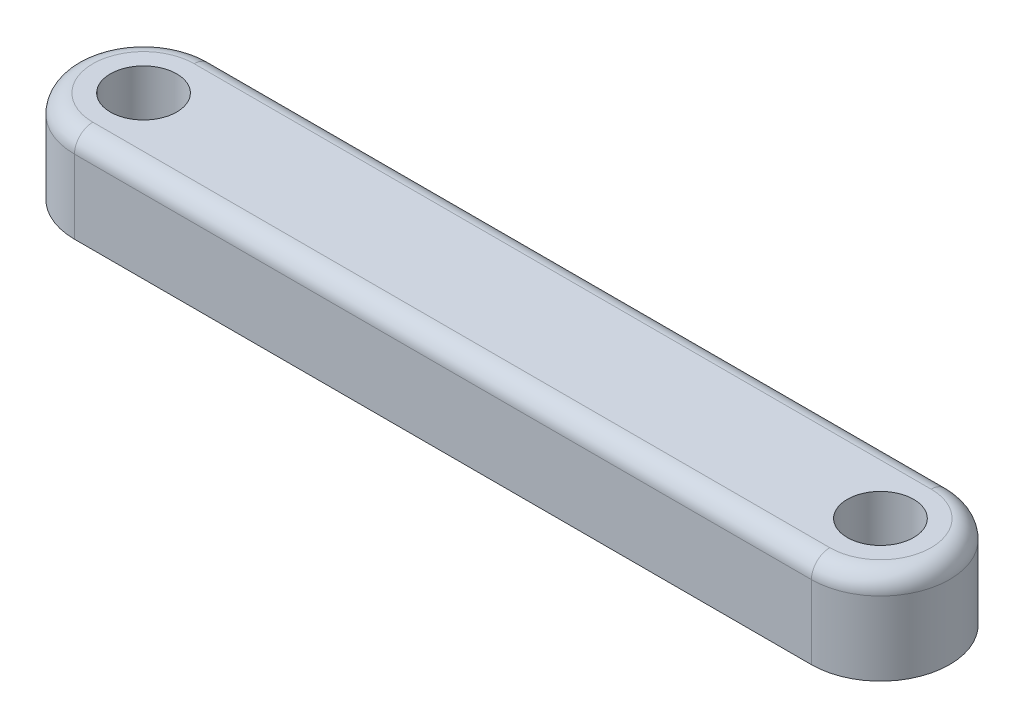
ISO-10303-21;
HEADER;
FILE_DESCRIPTION(('STEP AP214'),'2;1');
FILE_NAME('part.step','',(''),(''),'','','');
FILE_SCHEMA(('AUTOMOTIVE_DESIGN { 1 0 10303 214 1 1 1 1 }'));
ENDSEC;
DATA;
#1=APPLICATION_CONTEXT('core data for automotive mechanical design processes');
#2=APPLICATION_PROTOCOL_DEFINITION('international standard','automotive_design',2000,#1);
#3=PRODUCT_CONTEXT('',#1,'mechanical');
#4=PRODUCT('Part','Part','',(#3));
#5=PRODUCT_RELATED_PRODUCT_CATEGORY('part','',(#4));
#6=PRODUCT_DEFINITION_FORMATION('','',#4);
#7=PRODUCT_DEFINITION_CONTEXT('part definition',#1,'design');
#8=PRODUCT_DEFINITION('design','',#6,#7);
#9=PRODUCT_DEFINITION_SHAPE('','',#8);
#10=(LENGTH_UNIT() NAMED_UNIT(*) SI_UNIT(.MILLI.,.METRE.));
#11=(NAMED_UNIT(*) PLANE_ANGLE_UNIT() SI_UNIT($,.RADIAN.));
#12=(NAMED_UNIT(*) SI_UNIT($,.STERADIAN.) SOLID_ANGLE_UNIT());
#13=UNCERTAINTY_MEASURE_WITH_UNIT(LENGTH_MEASURE(1.E-05),#10,'distance_accuracy_value','');
#14=(GEOMETRIC_REPRESENTATION_CONTEXT(3) GLOBAL_UNCERTAINTY_ASSIGNED_CONTEXT((#13)) GLOBAL_UNIT_ASSIGNED_CONTEXT((#10,
#11,#12)) REPRESENTATION_CONTEXT('',''));
#15=CARTESIAN_POINT('',(0.,0.,0.));
#16=DIRECTION('',(0.,0.,1.));
#17=DIRECTION('',(1.,0.,0.));
#18=AXIS2_PLACEMENT_3D('',#15,#16,#17);
#19=CARTESIAN_POINT('',(0.,6.35,0.));
#20=DIRECTION('',(0.,1.,0.));
#21=DIRECTION('',(0.,0.,1.));
#22=AXIS2_PLACEMENT_3D('',#19,#20,#21);
#23=PLANE('',#22);
#24=DIRECTION('',(1.,0.,0.));
#25=VECTOR('',#24,1.);
#26=CARTESIAN_POINT('',(0.,6.35,3.4925));
#27=LINE('',#26,#25);
#28=CARTESIAN_POINT('',(-50.8,6.35,3.49250000000001));
#29=VERTEX_POINT('',#28);
#30=CARTESIAN_POINT('',(0.,6.35,3.4925));
#31=VERTEX_POINT('',#30);
#32=EDGE_CURVE('E164',#29,#31,#27,.T.);
#33=ORIENTED_EDGE('',*,*,#32,.T.);
#34=CARTESIAN_POINT('',(0.,6.35,0.));
#35=DIRECTION('',(0.,1.,0.));
#36=DIRECTION('',(0.,0.,1.));
#37=AXIS2_PLACEMENT_3D('',#34,#35,#36);
#38=CIRCLE('',#37,3.4925);
#39=CARTESIAN_POINT('',(0.,6.35,-3.4925));
#40=VERTEX_POINT('',#39);
#41=EDGE_CURVE('E167',#31,#40,#38,.T.);
#42=ORIENTED_EDGE('',*,*,#41,.T.);
#43=DIRECTION('',(-1.,0.,0.));
#44=VECTOR('',#43,1.);
#45=CARTESIAN_POINT('',(-50.8,6.35,-3.49249999999999));
#46=LINE('',#45,#44);
#47=CARTESIAN_POINT('',(-50.8,6.35,-3.49249999999999));
#48=VERTEX_POINT('',#47);
#49=EDGE_CURVE('E121',#40,#48,#46,.T.);
#50=ORIENTED_EDGE('',*,*,#49,.T.);
#51=CARTESIAN_POINT('',(-50.8,6.35,0.));
#52=DIRECTION('',(0.,1.,0.));
#53=DIRECTION('',(0.,0.,1.));
#54=AXIS2_PLACEMENT_3D('',#51,#52,#53);
#55=CIRCLE('',#54,3.4925);
#56=EDGE_CURVE('E161',#48,#29,#55,.T.);
#57=ORIENTED_EDGE('',*,*,#56,.T.);
#58=EDGE_LOOP('',(#33,#42,#50,#57));
#59=FACE_BOUND('',#58,.T.);
#60=CARTESIAN_POINT('',(-50.8,6.35,0.));
#61=DIRECTION('',(0.,1.,0.));
#62=DIRECTION('',(0.,0.,1.));
#63=AXIS2_PLACEMENT_3D('',#60,#61,#62);
#64=CIRCLE('',#63,2.286);
#65=CARTESIAN_POINT('',(-50.8,6.35,2.28600000000001));
#66=VERTEX_POINT('',#65);
#67=EDGE_CURVE('E138',#66,#66,#64,.T.);
#68=ORIENTED_EDGE('',*,*,#67,.F.);
#69=EDGE_LOOP('',(#68));
#70=FACE_BOUND('',#69,.T.);
#71=CARTESIAN_POINT('',(0.,6.35,0.));
#72=DIRECTION('',(0.,1.,0.));
#73=DIRECTION('',(0.,0.,1.));
#74=AXIS2_PLACEMENT_3D('',#71,#72,#73);
#75=CIRCLE('',#74,2.286);
#76=CARTESIAN_POINT('',(0.,6.35,2.286));
#77=VERTEX_POINT('',#76);
#78=EDGE_CURVE('E196',#77,#77,#75,.T.);
#79=ORIENTED_EDGE('',*,*,#78,.F.);
#80=EDGE_LOOP('',(#79));
#81=FACE_BOUND('',#80,.T.);
#82=ADVANCED_FACE('F43',(#59,#70,#81),#23,.T.);
#83=CARTESIAN_POINT('',(0.,0.,0.));
#84=DIRECTION('',(0.,1.,0.));
#85=DIRECTION('',(0.,0.,1.));
#86=AXIS2_PLACEMENT_3D('',#83,#84,#85);
#87=PLANE('',#86);
#88=CARTESIAN_POINT('',(0.,0.,0.));
#89=DIRECTION('',(0.,1.,0.));
#90=DIRECTION('',(0.,0.,1.));
#91=AXIS2_PLACEMENT_3D('',#88,#89,#90);
#92=CIRCLE('',#91,4.7625);
#93=CARTESIAN_POINT('',(0.,0.,4.7625));
#94=VERTEX_POINT('',#93);
#95=CARTESIAN_POINT('',(0.,0.,-4.7625));
#96=VERTEX_POINT('',#95);
#97=EDGE_CURVE('E129',#94,#96,#92,.T.);
#98=ORIENTED_EDGE('',*,*,#97,.F.);
#99=DIRECTION('',(1.,0.,0.));
#100=VECTOR('',#99,1.);
#101=CARTESIAN_POINT('',(0.,0.,4.7625));
#102=LINE('',#101,#100);
#103=CARTESIAN_POINT('',(-50.8,0.,4.76250000000001));
#104=VERTEX_POINT('',#103);
#105=EDGE_CURVE('E150',#104,#94,#102,.T.);
#106=ORIENTED_EDGE('',*,*,#105,.F.);
#107=CARTESIAN_POINT('',(-50.8,0.,0.));
#108=DIRECTION('',(0.,1.,0.));
#109=DIRECTION('',(0.,0.,1.));
#110=AXIS2_PLACEMENT_3D('',#107,#108,#109);
#111=CIRCLE('',#110,4.7625);
#112=CARTESIAN_POINT('',(-50.8,0.,-4.76249999999999));
#113=VERTEX_POINT('',#112);
#114=EDGE_CURVE('E131',#113,#104,#111,.T.);
#115=ORIENTED_EDGE('',*,*,#114,.F.);
#116=DIRECTION('',(-1.,0.,0.));
#117=VECTOR('',#116,1.);
#118=CARTESIAN_POINT('',(0.,0.,-4.7625));
#119=LINE('',#118,#117);
#120=EDGE_CURVE('E113',#96,#113,#119,.T.);
#121=ORIENTED_EDGE('',*,*,#120,.F.);
#122=EDGE_LOOP('',(#98,#106,#115,#121));
#123=FACE_BOUND('',#122,.T.);
#124=CARTESIAN_POINT('',(-50.8,0.,0.));
#125=DIRECTION('',(0.,1.,0.));
#126=DIRECTION('',(0.,0.,1.));
#127=AXIS2_PLACEMENT_3D('',#124,#125,#126);
#128=CIRCLE('',#127,2.286);
#129=CARTESIAN_POINT('',(-50.8,0.,2.28600000000001));
#130=VERTEX_POINT('',#129);
#131=EDGE_CURVE('E144',#130,#130,#128,.T.);
#132=ORIENTED_EDGE('',*,*,#131,.T.);
#133=EDGE_LOOP('',(#132));
#134=FACE_BOUND('',#133,.T.);
#135=CARTESIAN_POINT('',(0.,0.,0.));
#136=DIRECTION('',(0.,1.,0.));
#137=DIRECTION('',(0.,0.,1.));
#138=AXIS2_PLACEMENT_3D('',#135,#136,#137);
#139=CIRCLE('',#138,2.286);
#140=CARTESIAN_POINT('',(0.,0.,2.286));
#141=VERTEX_POINT('',#140);
#142=EDGE_CURVE('E191',#141,#141,#139,.T.);
#143=ORIENTED_EDGE('',*,*,#142,.T.);
#144=EDGE_LOOP('',(#143));
#145=FACE_BOUND('',#144,.T.);
#146=ADVANCED_FACE('F126',(#123,#134,#145),#87,.F.);
#147=CARTESIAN_POINT('',(0.,6.35,0.));
#148=DIRECTION('',(0.,-1.,0.));
#149=DIRECTION('',(0.,0.,-1.));
#150=AXIS2_PLACEMENT_3D('',#147,#148,#149);
#151=CYLINDRICAL_SURFACE('',#150,4.7625);
#152=DIRECTION('',(0.,-1.,0.));
#153=VECTOR('',#152,1.);
#154=CARTESIAN_POINT('',(0.,6.35,-4.7625));
#155=LINE('',#154,#153);
#156=CARTESIAN_POINT('',(0.,5.08,-4.7625));
#157=VERTEX_POINT('',#156);
#158=EDGE_CURVE('E110',#157,#96,#155,.T.);
#159=ORIENTED_EDGE('',*,*,#158,.F.);
#160=CARTESIAN_POINT('',(0.,5.08,0.));
#161=DIRECTION('',(0.,1.,0.));
#162=DIRECTION('',(0.,0.,1.));
#163=AXIS2_PLACEMENT_3D('',#160,#161,#162);
#164=CIRCLE('',#163,4.7625);
#165=CARTESIAN_POINT('',(0.,5.08,4.7625));
#166=VERTEX_POINT('',#165);
#167=EDGE_CURVE('E171',#157,#166,#164,.F.);
#168=ORIENTED_EDGE('',*,*,#167,.T.);
#169=DIRECTION('',(0.,-1.,0.));
#170=VECTOR('',#169,1.);
#171=CARTESIAN_POINT('',(0.,6.35,4.7625));
#172=LINE('',#171,#170);
#173=EDGE_CURVE('E135',#166,#94,#172,.T.);
#174=ORIENTED_EDGE('',*,*,#173,.T.);
#175=ORIENTED_EDGE('',*,*,#97,.T.);
#176=EDGE_LOOP('',(#159,#168,#174,#175));
#177=FACE_BOUND('',#176,.T.);
#178=ADVANCED_FACE('F134',(#177),#151,.T.);
#179=CARTESIAN_POINT('',(0.,6.35,-4.7625));
#180=DIRECTION('',(0.,0.,1.));
#181=DIRECTION('',(1.,0.,0.));
#182=AXIS2_PLACEMENT_3D('',#179,#180,#181);
#183=PLANE('',#182);
#184=DIRECTION('',(0.,-1.,0.));
#185=VECTOR('',#184,1.);
#186=CARTESIAN_POINT('',(-50.8,6.35,-4.76249999999999));
#187=LINE('',#186,#185);
#188=CARTESIAN_POINT('',(-50.8,5.08,-4.76249999999999));
#189=VERTEX_POINT('',#188);
#190=EDGE_CURVE('E122',#189,#113,#187,.T.);
#191=ORIENTED_EDGE('',*,*,#190,.F.);
#192=DIRECTION('',(-1.,0.,0.));
#193=VECTOR('',#192,1.);
#194=CARTESIAN_POINT('',(0.,5.08,-4.7625));
#195=LINE('',#194,#193);
#196=EDGE_CURVE('E11',#189,#157,#195,.F.);
#197=ORIENTED_EDGE('',*,*,#196,.T.);
#198=ORIENTED_EDGE('',*,*,#158,.T.);
#199=ORIENTED_EDGE('',*,*,#120,.T.);
#200=EDGE_LOOP('',(#191,#197,#198,#199));
#201=FACE_BOUND('',#200,.T.);
#202=ADVANCED_FACE('F112',(#201),#183,.F.);
#203=CARTESIAN_POINT('',(-50.8,6.35,0.));
#204=DIRECTION('',(0.,-1.,0.));
#205=DIRECTION('',(0.,0.,-1.));
#206=AXIS2_PLACEMENT_3D('',#203,#204,#205);
#207=CYLINDRICAL_SURFACE('',#206,4.7625);
#208=DIRECTION('',(0.,-1.,0.));
#209=VECTOR('',#208,1.);
#210=CARTESIAN_POINT('',(-50.8,6.35,4.76250000000001));
#211=LINE('',#210,#209);
#212=CARTESIAN_POINT('',(-50.8,5.08,4.76250000000001));
#213=VERTEX_POINT('',#212);
#214=EDGE_CURVE('E154',#213,#104,#211,.T.);
#215=ORIENTED_EDGE('',*,*,#214,.F.);
#216=CARTESIAN_POINT('',(-50.8,5.08,0.));
#217=DIRECTION('',(0.,1.,0.));
#218=DIRECTION('',(0.,0.,1.));
#219=AXIS2_PLACEMENT_3D('',#216,#217,#218);
#220=CIRCLE('',#219,4.7625);
#221=EDGE_CURVE('E53',#213,#189,#220,.F.);
#222=ORIENTED_EDGE('',*,*,#221,.T.);
#223=ORIENTED_EDGE('',*,*,#190,.T.);
#224=ORIENTED_EDGE('',*,*,#114,.T.);
#225=EDGE_LOOP('',(#215,#222,#223,#224));
#226=FACE_BOUND('',#225,.T.);
#227=ADVANCED_FACE('F221',(#226),#207,.T.);
#228=CARTESIAN_POINT('',(0.,6.35,4.7625));
#229=DIRECTION('',(0.,0.,-1.));
#230=DIRECTION('',(-1.,0.,0.));
#231=AXIS2_PLACEMENT_3D('',#228,#229,#230);
#232=PLANE('',#231);
#233=ORIENTED_EDGE('',*,*,#173,.F.);
#234=DIRECTION('',(1.,0.,0.));
#235=VECTOR('',#234,1.);
#236=CARTESIAN_POINT('',(-50.8,5.08,4.76250000000001));
#237=LINE('',#236,#235);
#238=EDGE_CURVE('E72',#166,#213,#237,.F.);
#239=ORIENTED_EDGE('',*,*,#238,.T.);
#240=ORIENTED_EDGE('',*,*,#214,.T.);
#241=ORIENTED_EDGE('',*,*,#105,.T.);
#242=EDGE_LOOP('',(#233,#239,#240,#241));
#243=FACE_BOUND('',#242,.T.);
#244=ADVANCED_FACE('F212',(#243),#232,.F.);
#245=CARTESIAN_POINT('',(-50.8,6.35,0.));
#246=DIRECTION('',(0.,-1.,0.));
#247=DIRECTION('',(0.,0.,-1.));
#248=AXIS2_PLACEMENT_3D('',#245,#246,#247);
#249=CYLINDRICAL_SURFACE('',#248,2.286);
#250=ORIENTED_EDGE('',*,*,#67,.T.);
#251=EDGE_LOOP('',(#250));
#252=FACE_BOUND('',#251,.T.);
#253=ORIENTED_EDGE('',*,*,#131,.F.);
#254=EDGE_LOOP('',(#253));
#255=FACE_BOUND('',#254,.T.);
#256=ADVANCED_FACE('F209',(#252,#255),#249,.F.);
#257=CARTESIAN_POINT('',(0.,6.35,0.));
#258=DIRECTION('',(0.,-1.,0.));
#259=DIRECTION('',(0.,0.,-1.));
#260=AXIS2_PLACEMENT_3D('',#257,#258,#259);
#261=CYLINDRICAL_SURFACE('',#260,2.286);
#262=ORIENTED_EDGE('',*,*,#78,.T.);
#263=EDGE_LOOP('',(#262));
#264=FACE_BOUND('',#263,.T.);
#265=ORIENTED_EDGE('',*,*,#142,.F.);
#266=EDGE_LOOP('',(#265));
#267=FACE_BOUND('',#266,.T.);
#268=ADVANCED_FACE('F211',(#264,#267),#261,.F.);
#269=CARTESIAN_POINT('',(-50.8,5.08,0.));
#270=DIRECTION('',(0.,1.,0.));
#271=DIRECTION('',(0.,0.,1.));
#272=AXIS2_PLACEMENT_3D('',#269,#270,#271);
#273=TOROIDAL_SURFACE('',#272,3.4925,1.27);
#274=CARTESIAN_POINT('',(-50.8,5.08,-3.49249999999999));
#275=DIRECTION('',(1.,0.,0.));
#276=DIRECTION('',(0.,0.,-1.));
#277=AXIS2_PLACEMENT_3D('',#274,#275,#276);
#278=CIRCLE('',#277,1.27);
#279=EDGE_CURVE('E183',#189,#48,#278,.T.);
#280=ORIENTED_EDGE('',*,*,#279,.F.);
#281=ORIENTED_EDGE('',*,*,#221,.F.);
#282=CARTESIAN_POINT('',(-50.8,5.08,3.49250000000001));
#283=DIRECTION('',(1.,0.,0.));
#284=DIRECTION('',(0.,0.,-1.));
#285=AXIS2_PLACEMENT_3D('',#282,#283,#284);
#286=CIRCLE('',#285,1.27);
#287=EDGE_CURVE('E47',#29,#213,#286,.T.);
#288=ORIENTED_EDGE('',*,*,#287,.F.);
#289=ORIENTED_EDGE('',*,*,#56,.F.);
#290=EDGE_LOOP('',(#280,#281,#288,#289));
#291=FACE_BOUND('',#290,.T.);
#292=ADVANCED_FACE('F45',(#291),#273,.T.);
#293=CARTESIAN_POINT('',(0.,5.08,3.4925));
#294=DIRECTION('',(-1.,0.,0.));
#295=DIRECTION('',(0.,0.,1.));
#296=AXIS2_PLACEMENT_3D('',#293,#294,#295);
#297=CYLINDRICAL_SURFACE('',#296,1.27);
#298=ORIENTED_EDGE('',*,*,#287,.T.);
#299=ORIENTED_EDGE('',*,*,#238,.F.);
#300=CARTESIAN_POINT('',(0.,5.08,3.4925));
#301=DIRECTION('',(1.,0.,0.));
#302=DIRECTION('',(0.,0.,-1.));
#303=AXIS2_PLACEMENT_3D('',#300,#301,#302);
#304=CIRCLE('',#303,1.27);
#305=EDGE_CURVE('E181',#31,#166,#304,.T.);
#306=ORIENTED_EDGE('',*,*,#305,.F.);
#307=ORIENTED_EDGE('',*,*,#32,.F.);
#308=EDGE_LOOP('',(#298,#299,#306,#307));
#309=FACE_BOUND('',#308,.T.);
#310=ADVANCED_FACE('F243',(#309),#297,.T.);
#311=CARTESIAN_POINT('',(0.,5.08,-3.4925));
#312=DIRECTION('',(1.,0.,0.));
#313=DIRECTION('',(0.,0.,-1.));
#314=AXIS2_PLACEMENT_3D('',#311,#312,#313);
#315=CYLINDRICAL_SURFACE('',#314,1.27);
#316=ORIENTED_EDGE('',*,*,#279,.T.);
#317=ORIENTED_EDGE('',*,*,#49,.F.);
#318=CARTESIAN_POINT('',(0.,5.08,-3.4925));
#319=DIRECTION('',(1.,0.,0.));
#320=DIRECTION('',(0.,0.,-1.));
#321=AXIS2_PLACEMENT_3D('',#318,#319,#320);
#322=CIRCLE('',#321,1.27);
#323=EDGE_CURVE('E178',#157,#40,#322,.T.);
#324=ORIENTED_EDGE('',*,*,#323,.F.);
#325=ORIENTED_EDGE('',*,*,#196,.F.);
#326=EDGE_LOOP('',(#316,#317,#324,#325));
#327=FACE_BOUND('',#326,.T.);
#328=ADVANCED_FACE('F240',(#327),#315,.T.);
#329=CARTESIAN_POINT('',(0.,5.08,0.));
#330=DIRECTION('',(0.,1.,0.));
#331=DIRECTION('',(0.,0.,1.));
#332=AXIS2_PLACEMENT_3D('',#329,#330,#331);
#333=TOROIDAL_SURFACE('',#332,3.4925,1.27);
#334=ORIENTED_EDGE('',*,*,#305,.T.);
#335=ORIENTED_EDGE('',*,*,#167,.F.);
#336=ORIENTED_EDGE('',*,*,#323,.T.);
#337=ORIENTED_EDGE('',*,*,#41,.F.);
#338=EDGE_LOOP('',(#334,#335,#336,#337));
#339=FACE_BOUND('',#338,.T.);
#340=ADVANCED_FACE('F237',(#339),#333,.T.);
#341=CLOSED_SHELL('',(#82,#146,#178,#202,#227,#244,#256,#268,#292,#310,#328,#340));
#342=MANIFOLD_SOLID_BREP('B2',#341);
#343=ADVANCED_BREP_SHAPE_REPRESENTATION('',(#18,#342),#14);
#344=SHAPE_DEFINITION_REPRESENTATION(#9,#343);
ENDSEC;
END-ISO-10303-21;
